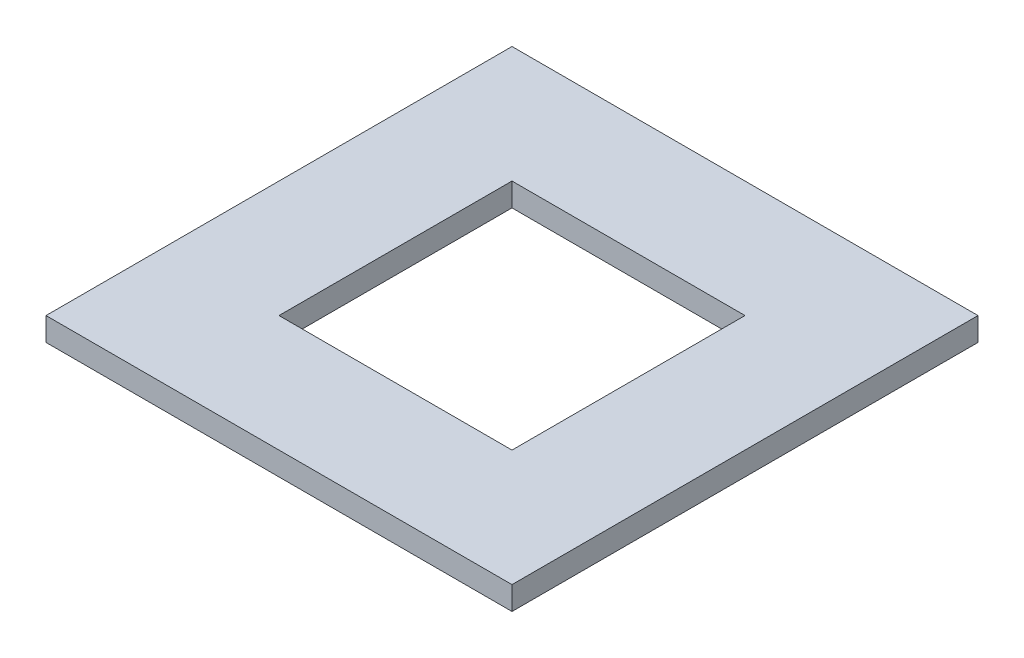
ISO-10303-21;
HEADER;
FILE_DESCRIPTION(('STEP AP214'),'2;1');
FILE_NAME('part.step','',(''),(''),'','','');
FILE_SCHEMA(('AUTOMOTIVE_DESIGN { 1 0 10303 214 1 1 1 1 }'));
ENDSEC;
DATA;
#1=APPLICATION_CONTEXT('core data for automotive mechanical design processes');
#2=APPLICATION_PROTOCOL_DEFINITION('international standard','automotive_design',2000,#1);
#3=PRODUCT_CONTEXT('',#1,'mechanical');
#4=PRODUCT('Part','Part','',(#3));
#5=PRODUCT_RELATED_PRODUCT_CATEGORY('part','',(#4));
#6=PRODUCT_DEFINITION_FORMATION('','',#4);
#7=PRODUCT_DEFINITION_CONTEXT('part definition',#1,'design');
#8=PRODUCT_DEFINITION('design','',#6,#7);
#9=PRODUCT_DEFINITION_SHAPE('','',#8);
#10=(LENGTH_UNIT() NAMED_UNIT(*) SI_UNIT(.MILLI.,.METRE.));
#11=(NAMED_UNIT(*) PLANE_ANGLE_UNIT() SI_UNIT($,.RADIAN.));
#12=(NAMED_UNIT(*) SI_UNIT($,.STERADIAN.) SOLID_ANGLE_UNIT());
#13=UNCERTAINTY_MEASURE_WITH_UNIT(LENGTH_MEASURE(1.E-05),#10,'distance_accuracy_value','');
#14=(GEOMETRIC_REPRESENTATION_CONTEXT(3) GLOBAL_UNCERTAINTY_ASSIGNED_CONTEXT((#13)) GLOBAL_UNIT_ASSIGNED_CONTEXT((#10,
#11,#12)) REPRESENTATION_CONTEXT('',''));
#15=CARTESIAN_POINT('',(0.,0.,0.));
#16=DIRECTION('',(0.,0.,1.));
#17=DIRECTION('',(1.,0.,0.));
#18=AXIS2_PLACEMENT_3D('',#15,#16,#17);
#19=CARTESIAN_POINT('',(0.,10.,0.));
#20=DIRECTION('',(0.,-1.,0.));
#21=DIRECTION('',(0.,0.,-1.));
#22=AXIS2_PLACEMENT_3D('',#19,#20,#21);
#23=PLANE('',#22);
#24=DIRECTION('',(-1.,0.,0.));
#25=VECTOR('',#24,1.);
#26=CARTESIAN_POINT('',(-100.,10.,-100.));
#27=LINE('',#26,#25);
#28=CARTESIAN_POINT('',(99.9999999999999,10.,-100.));
#29=VERTEX_POINT('',#28);
#30=CARTESIAN_POINT('',(-100.,10.,-100.));
#31=VERTEX_POINT('',#30);
#32=EDGE_CURVE('E134',#29,#31,#27,.T.);
#33=ORIENTED_EDGE('',*,*,#32,.T.);
#34=DIRECTION('',(0.,0.,1.));
#35=VECTOR('',#34,1.);
#36=CARTESIAN_POINT('',(-100.,10.,-100.));
#37=LINE('',#36,#35);
#38=CARTESIAN_POINT('',(-100.,10.,100.));
#39=VERTEX_POINT('',#38);
#40=EDGE_CURVE('E137',#31,#39,#37,.T.);
#41=ORIENTED_EDGE('',*,*,#40,.T.);
#42=DIRECTION('',(1.,0.,0.));
#43=VECTOR('',#42,1.);
#44=CARTESIAN_POINT('',(-100.,10.,100.));
#45=LINE('',#44,#43);
#46=CARTESIAN_POINT('',(99.9999999999999,10.,100.));
#47=VERTEX_POINT('',#46);
#48=EDGE_CURVE('E140',#39,#47,#45,.T.);
#49=ORIENTED_EDGE('',*,*,#48,.T.);
#50=DIRECTION('',(0.,0.,-1.));
#51=VECTOR('',#50,1.);
#52=CARTESIAN_POINT('',(99.9999999999999,10.,-100.));
#53=LINE('',#52,#51);
#54=EDGE_CURVE('E142',#47,#29,#53,.T.);
#55=ORIENTED_EDGE('',*,*,#54,.T.);
#56=EDGE_LOOP('',(#33,#41,#49,#55));
#57=FACE_BOUND('',#56,.T.);
#58=DIRECTION('',(0.,0.,-1.));
#59=VECTOR('',#58,1.);
#60=CARTESIAN_POINT('',(49.9999999999999,10.,-50.));
#61=LINE('',#60,#59);
#62=CARTESIAN_POINT('',(49.9999999999999,10.,50.));
#63=VERTEX_POINT('',#62);
#64=CARTESIAN_POINT('',(49.9999999999999,10.,-50.));
#65=VERTEX_POINT('',#64);
#66=EDGE_CURVE('E98',#63,#65,#61,.T.);
#67=ORIENTED_EDGE('',*,*,#66,.F.);
#68=DIRECTION('',(1.,0.,0.));
#69=VECTOR('',#68,1.);
#70=CARTESIAN_POINT('',(-50.0000000000001,10.,50.));
#71=LINE('',#70,#69);
#72=CARTESIAN_POINT('',(-50.0000000000001,10.,50.));
#73=VERTEX_POINT('',#72);
#74=EDGE_CURVE('E120',#73,#63,#71,.T.);
#75=ORIENTED_EDGE('',*,*,#74,.F.);
#76=DIRECTION('',(0.,0.,1.));
#77=VECTOR('',#76,1.);
#78=CARTESIAN_POINT('',(-50.0000000000001,10.,-50.));
#79=LINE('',#78,#77);
#80=CARTESIAN_POINT('',(-50.0000000000001,10.,-50.));
#81=VERTEX_POINT('',#80);
#82=EDGE_CURVE('E118',#81,#73,#79,.T.);
#83=ORIENTED_EDGE('',*,*,#82,.F.);
#84=DIRECTION('',(-1.,0.,0.));
#85=VECTOR('',#84,1.);
#86=CARTESIAN_POINT('',(-50.0000000000001,10.,-50.));
#87=LINE('',#86,#85);
#88=EDGE_CURVE('E106',#65,#81,#87,.T.);
#89=ORIENTED_EDGE('',*,*,#88,.F.);
#90=EDGE_LOOP('',(#67,#75,#83,#89));
#91=FACE_BOUND('',#90,.T.);
#92=ADVANCED_FACE('F33',(#57,#91),#23,.F.);
#93=CARTESIAN_POINT('',(0.,0.,0.));
#94=DIRECTION('',(0.,-1.,0.));
#95=DIRECTION('',(0.,0.,-1.));
#96=AXIS2_PLACEMENT_3D('',#93,#94,#95);
#97=PLANE('',#96);
#98=DIRECTION('',(-1.,0.,0.));
#99=VECTOR('',#98,1.);
#100=CARTESIAN_POINT('',(-100.,0.,-100.));
#101=LINE('',#100,#99);
#102=CARTESIAN_POINT('',(99.9999999999999,0.,-100.));
#103=VERTEX_POINT('',#102);
#104=CARTESIAN_POINT('',(-100.,0.,-100.));
#105=VERTEX_POINT('',#104);
#106=EDGE_CURVE('E114',#103,#105,#101,.T.);
#107=ORIENTED_EDGE('',*,*,#106,.F.);
#108=DIRECTION('',(0.,0.,-1.));
#109=VECTOR('',#108,1.);
#110=CARTESIAN_POINT('',(99.9999999999999,0.,-100.));
#111=LINE('',#110,#109);
#112=CARTESIAN_POINT('',(99.9999999999999,0.,100.));
#113=VERTEX_POINT('',#112);
#114=EDGE_CURVE('E138',#113,#103,#111,.T.);
#115=ORIENTED_EDGE('',*,*,#114,.F.);
#116=DIRECTION('',(1.,0.,0.));
#117=VECTOR('',#116,1.);
#118=CARTESIAN_POINT('',(-100.,0.,100.));
#119=LINE('',#118,#117);
#120=CARTESIAN_POINT('',(-100.,0.,100.));
#121=VERTEX_POINT('',#120);
#122=EDGE_CURVE('E149',#121,#113,#119,.T.);
#123=ORIENTED_EDGE('',*,*,#122,.F.);
#124=DIRECTION('',(0.,0.,1.));
#125=VECTOR('',#124,1.);
#126=CARTESIAN_POINT('',(-100.,0.,-100.));
#127=LINE('',#126,#125);
#128=EDGE_CURVE('E147',#105,#121,#127,.T.);
#129=ORIENTED_EDGE('',*,*,#128,.F.);
#130=EDGE_LOOP('',(#107,#115,#123,#129));
#131=FACE_BOUND('',#130,.T.);
#132=DIRECTION('',(1.,0.,0.));
#133=VECTOR('',#132,1.);
#134=CARTESIAN_POINT('',(-50.0000000000001,0.,50.));
#135=LINE('',#134,#133);
#136=CARTESIAN_POINT('',(-50.0000000000001,0.,50.));
#137=VERTEX_POINT('',#136);
#138=CARTESIAN_POINT('',(49.9999999999999,0.,50.));
#139=VERTEX_POINT('',#138);
#140=EDGE_CURVE('E107',#137,#139,#135,.T.);
#141=ORIENTED_EDGE('',*,*,#140,.T.);
#142=DIRECTION('',(0.,0.,-1.));
#143=VECTOR('',#142,1.);
#144=CARTESIAN_POINT('',(49.9999999999999,0.,-50.));
#145=LINE('',#144,#143);
#146=CARTESIAN_POINT('',(49.9999999999999,0.,-50.));
#147=VERTEX_POINT('',#146);
#148=EDGE_CURVE('E56',#139,#147,#145,.T.);
#149=ORIENTED_EDGE('',*,*,#148,.T.);
#150=DIRECTION('',(-1.,0.,0.));
#151=VECTOR('',#150,1.);
#152=CARTESIAN_POINT('',(-50.0000000000001,0.,-50.));
#153=LINE('',#152,#151);
#154=CARTESIAN_POINT('',(-50.0000000000001,0.,-50.));
#155=VERTEX_POINT('',#154);
#156=EDGE_CURVE('E113',#147,#155,#153,.T.);
#157=ORIENTED_EDGE('',*,*,#156,.T.);
#158=DIRECTION('',(0.,0.,1.));
#159=VECTOR('',#158,1.);
#160=CARTESIAN_POINT('',(-50.0000000000001,0.,-50.));
#161=LINE('',#160,#159);
#162=EDGE_CURVE('E126',#155,#137,#161,.T.);
#163=ORIENTED_EDGE('',*,*,#162,.T.);
#164=EDGE_LOOP('',(#141,#149,#157,#163));
#165=FACE_BOUND('',#164,.T.);
#166=ADVANCED_FACE('F167',(#131,#165),#97,.T.);
#167=CARTESIAN_POINT('',(-100.,10.,-100.));
#168=DIRECTION('',(0.,0.,1.));
#169=DIRECTION('',(1.,0.,0.));
#170=AXIS2_PLACEMENT_3D('',#167,#168,#169);
#171=PLANE('',#170);
#172=ORIENTED_EDGE('',*,*,#106,.T.);
#173=DIRECTION('',(0.,-1.,0.));
#174=VECTOR('',#173,1.);
#175=CARTESIAN_POINT('',(-100.,10.,-100.));
#176=LINE('',#175,#174);
#177=EDGE_CURVE('E11',#31,#105,#176,.T.);
#178=ORIENTED_EDGE('',*,*,#177,.F.);
#179=ORIENTED_EDGE('',*,*,#32,.F.);
#180=DIRECTION('',(0.,-1.,0.));
#181=VECTOR('',#180,1.);
#182=CARTESIAN_POINT('',(99.9999999999999,10.,-100.));
#183=LINE('',#182,#181);
#184=EDGE_CURVE('E144',#29,#103,#183,.T.);
#185=ORIENTED_EDGE('',*,*,#184,.T.);
#186=EDGE_LOOP('',(#172,#178,#179,#185));
#187=FACE_BOUND('',#186,.T.);
#188=ADVANCED_FACE('F35',(#187),#171,.F.);
#189=CARTESIAN_POINT('',(-100.,10.,-100.));
#190=DIRECTION('',(1.,0.,0.));
#191=DIRECTION('',(0.,0.,-1.));
#192=AXIS2_PLACEMENT_3D('',#189,#190,#191);
#193=PLANE('',#192);
#194=ORIENTED_EDGE('',*,*,#128,.T.);
#195=DIRECTION('',(0.,-1.,0.));
#196=VECTOR('',#195,1.);
#197=CARTESIAN_POINT('',(-100.,10.,100.));
#198=LINE('',#197,#196);
#199=EDGE_CURVE('E41',#39,#121,#198,.T.);
#200=ORIENTED_EDGE('',*,*,#199,.F.);
#201=ORIENTED_EDGE('',*,*,#40,.F.);
#202=ORIENTED_EDGE('',*,*,#177,.T.);
#203=EDGE_LOOP('',(#194,#200,#201,#202));
#204=FACE_BOUND('',#203,.T.);
#205=ADVANCED_FACE('F177',(#204),#193,.F.);
#206=CARTESIAN_POINT('',(-100.,10.,100.));
#207=DIRECTION('',(0.,0.,-1.));
#208=DIRECTION('',(-1.,0.,0.));
#209=AXIS2_PLACEMENT_3D('',#206,#207,#208);
#210=PLANE('',#209);
#211=ORIENTED_EDGE('',*,*,#122,.T.);
#212=DIRECTION('',(0.,-1.,0.));
#213=VECTOR('',#212,1.);
#214=CARTESIAN_POINT('',(99.9999999999999,10.,100.));
#215=LINE('',#214,#213);
#216=EDGE_CURVE('E154',#47,#113,#215,.T.);
#217=ORIENTED_EDGE('',*,*,#216,.F.);
#218=ORIENTED_EDGE('',*,*,#48,.F.);
#219=ORIENTED_EDGE('',*,*,#199,.T.);
#220=EDGE_LOOP('',(#211,#217,#218,#219));
#221=FACE_BOUND('',#220,.T.);
#222=ADVANCED_FACE('F161',(#221),#210,.F.);
#223=CARTESIAN_POINT('',(99.9999999999999,10.,-100.));
#224=DIRECTION('',(-1.,0.,0.));
#225=DIRECTION('',(0.,0.,1.));
#226=AXIS2_PLACEMENT_3D('',#223,#224,#225);
#227=PLANE('',#226);
#228=ORIENTED_EDGE('',*,*,#114,.T.);
#229=ORIENTED_EDGE('',*,*,#184,.F.);
#230=ORIENTED_EDGE('',*,*,#54,.F.);
#231=ORIENTED_EDGE('',*,*,#216,.T.);
#232=EDGE_LOOP('',(#228,#229,#230,#231));
#233=FACE_BOUND('',#232,.T.);
#234=ADVANCED_FACE('F171',(#233),#227,.F.);
#235=CARTESIAN_POINT('',(49.9999999999999,10.,-50.));
#236=DIRECTION('',(-1.,0.,0.));
#237=DIRECTION('',(0.,0.,1.));
#238=AXIS2_PLACEMENT_3D('',#235,#236,#237);
#239=PLANE('',#238);
#240=ORIENTED_EDGE('',*,*,#148,.F.);
#241=DIRECTION('',(0.,-1.,0.));
#242=VECTOR('',#241,1.);
#243=CARTESIAN_POINT('',(49.9999999999999,10.,50.));
#244=LINE('',#243,#242);
#245=EDGE_CURVE('E102',#63,#139,#244,.T.);
#246=ORIENTED_EDGE('',*,*,#245,.F.);
#247=ORIENTED_EDGE('',*,*,#66,.T.);
#248=DIRECTION('',(0.,-1.,0.));
#249=VECTOR('',#248,1.);
#250=CARTESIAN_POINT('',(49.9999999999999,10.,-50.));
#251=LINE('',#250,#249);
#252=EDGE_CURVE('E101',#65,#147,#251,.T.);
#253=ORIENTED_EDGE('',*,*,#252,.T.);
#254=EDGE_LOOP('',(#240,#246,#247,#253));
#255=FACE_BOUND('',#254,.T.);
#256=ADVANCED_FACE('F100',(#255),#239,.T.);
#257=CARTESIAN_POINT('',(-50.0000000000001,10.,-50.));
#258=DIRECTION('',(0.,0.,1.));
#259=DIRECTION('',(1.,0.,0.));
#260=AXIS2_PLACEMENT_3D('',#257,#258,#259);
#261=PLANE('',#260);
#262=ORIENTED_EDGE('',*,*,#156,.F.);
#263=ORIENTED_EDGE('',*,*,#252,.F.);
#264=ORIENTED_EDGE('',*,*,#88,.T.);
#265=DIRECTION('',(0.,-1.,0.));
#266=VECTOR('',#265,1.);
#267=CARTESIAN_POINT('',(-50.0000000000001,10.,-50.));
#268=LINE('',#267,#266);
#269=EDGE_CURVE('E115',#81,#155,#268,.T.);
#270=ORIENTED_EDGE('',*,*,#269,.T.);
#271=EDGE_LOOP('',(#262,#263,#264,#270));
#272=FACE_BOUND('',#271,.T.);
#273=ADVANCED_FACE('F110',(#272),#261,.T.);
#274=CARTESIAN_POINT('',(-50.0000000000001,10.,-50.));
#275=DIRECTION('',(1.,0.,0.));
#276=DIRECTION('',(0.,0.,-1.));
#277=AXIS2_PLACEMENT_3D('',#274,#275,#276);
#278=PLANE('',#277);
#279=ORIENTED_EDGE('',*,*,#162,.F.);
#280=ORIENTED_EDGE('',*,*,#269,.F.);
#281=ORIENTED_EDGE('',*,*,#82,.T.);
#282=DIRECTION('',(0.,-1.,0.));
#283=VECTOR('',#282,1.);
#284=CARTESIAN_POINT('',(-50.0000000000001,10.,50.));
#285=LINE('',#284,#283);
#286=EDGE_CURVE('E48',#73,#137,#285,.T.);
#287=ORIENTED_EDGE('',*,*,#286,.T.);
#288=EDGE_LOOP('',(#279,#280,#281,#287));
#289=FACE_BOUND('',#288,.T.);
#290=ADVANCED_FACE('F200',(#289),#278,.T.);
#291=CARTESIAN_POINT('',(-50.0000000000001,10.,50.));
#292=DIRECTION('',(0.,0.,-1.));
#293=DIRECTION('',(-1.,0.,0.));
#294=AXIS2_PLACEMENT_3D('',#291,#292,#293);
#295=PLANE('',#294);
#296=ORIENTED_EDGE('',*,*,#140,.F.);
#297=ORIENTED_EDGE('',*,*,#286,.F.);
#298=ORIENTED_EDGE('',*,*,#74,.T.);
#299=ORIENTED_EDGE('',*,*,#245,.T.);
#300=EDGE_LOOP('',(#296,#297,#298,#299));
#301=FACE_BOUND('',#300,.T.);
#302=ADVANCED_FACE('F204',(#301),#295,.T.);
#303=CLOSED_SHELL('',(#92,#166,#188,#205,#222,#234,#256,#273,#290,#302));
#304=MANIFOLD_SOLID_BREP('B2',#303);
#305=ADVANCED_BREP_SHAPE_REPRESENTATION('',(#18,#304),#14);
#306=SHAPE_DEFINITION_REPRESENTATION(#9,#305);
ENDSEC;
END-ISO-10303-21;
